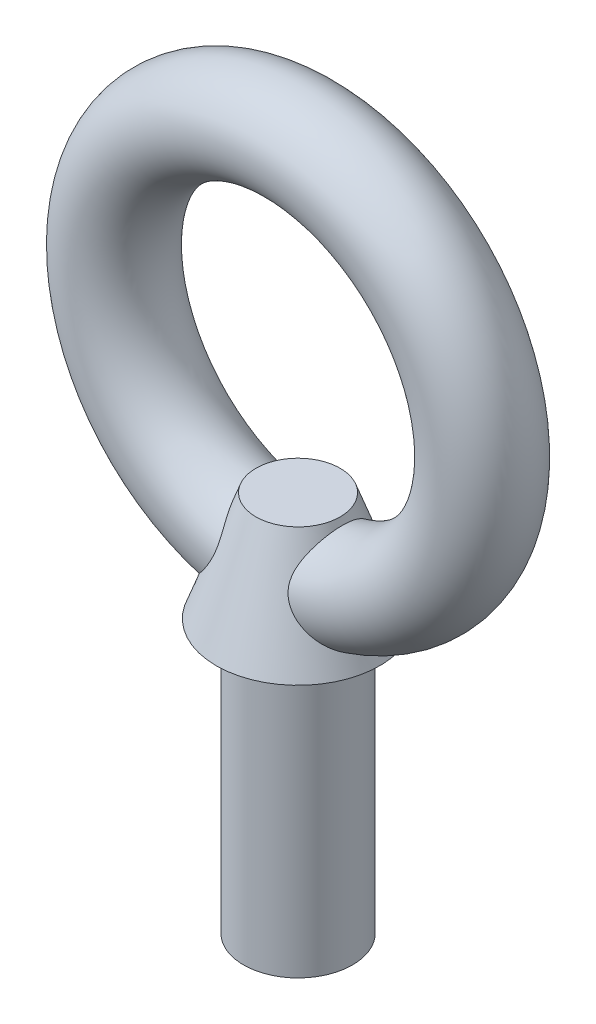
ISO-10303-21;
HEADER;
FILE_DESCRIPTION(('STEP AP214'),'2;1');
FILE_NAME('part.step','',(''),(''),'','','');
FILE_SCHEMA(('AUTOMOTIVE_DESIGN { 1 0 10303 214 1 1 1 1 }'));
ENDSEC;
DATA;
#1=APPLICATION_CONTEXT('core data for automotive mechanical design processes');
#2=APPLICATION_PROTOCOL_DEFINITION('international standard','automotive_design',2000,#1);
#3=PRODUCT_CONTEXT('',#1,'mechanical');
#4=PRODUCT('Part','Part','',(#3));
#5=PRODUCT_RELATED_PRODUCT_CATEGORY('part','',(#4));
#6=PRODUCT_DEFINITION_FORMATION('','',#4);
#7=PRODUCT_DEFINITION_CONTEXT('part definition',#1,'design');
#8=PRODUCT_DEFINITION('design','',#6,#7);
#9=PRODUCT_DEFINITION_SHAPE('','',#8);
#10=(LENGTH_UNIT() NAMED_UNIT(*) SI_UNIT(.MILLI.,.METRE.));
#11=(NAMED_UNIT(*) PLANE_ANGLE_UNIT() SI_UNIT($,.RADIAN.));
#12=(NAMED_UNIT(*) SI_UNIT($,.STERADIAN.) SOLID_ANGLE_UNIT());
#13=UNCERTAINTY_MEASURE_WITH_UNIT(LENGTH_MEASURE(1.E-05),#10,'distance_accuracy_value','');
#14=(GEOMETRIC_REPRESENTATION_CONTEXT(3) GLOBAL_UNCERTAINTY_ASSIGNED_CONTEXT((#13)) GLOBAL_UNIT_ASSIGNED_CONTEXT((#10,
#11,#12)) REPRESENTATION_CONTEXT('',''));
#15=CARTESIAN_POINT('',(0.,0.,0.));
#16=DIRECTION('',(0.,0.,1.));
#17=DIRECTION('',(1.,0.,0.));
#18=AXIS2_PLACEMENT_3D('',#15,#16,#17);
#19=CARTESIAN_POINT('',(0.,-8.5,0.));
#20=DIRECTION('',(0.,-1.,0.));
#21=DIRECTION('',(0.,0.,1.));
#22=AXIS2_PLACEMENT_3D('',#19,#20,#21);
#23=CONICAL_SURFACE('',#22,3.,0.349065850398867);
#24=CARTESIAN_POINT('',(-2.56859902802234,-7.79714728492263,-0.96583477141889));
#25=CARTESIAN_POINT('',(-2.60966585182649,-7.83351581721889,-0.894221925342271));
#26=CARTESIAN_POINT('',(-2.6469279222764,-7.86597148150646,-0.818338519497709));
#27=CARTESIAN_POINT('',(-2.71192304057324,-7.92206599396319,-0.659457913837988));
#28=CARTESIAN_POINT('',(-2.7396485593138,-7.94569787701139,-0.57645515758886));
#29=CARTESIAN_POINT('',(-2.78401330285254,-7.98331791129675,-0.405090654493006));
#30=CARTESIAN_POINT('',(-2.80061498246472,-7.99727340825456,-0.316711846075298));
#31=CARTESIAN_POINT('',(-2.82148845901204,-8.01479748178627,-0.137520355516204));
#32=CARTESIAN_POINT('',(-2.82576610361467,-8.01837098454979,-0.0467088483255237));
#33=CARTESIAN_POINT('',(-2.82182997114935,-8.01507424169583,0.129630225218617));
#34=CARTESIAN_POINT('',(-2.81426365062231,-8.00874532557002,0.215183674735722));
#35=CARTESIAN_POINT('',(-2.7882945188289,-7.98690100722911,0.38340986414287));
#36=CARTESIAN_POINT('',(-2.76989127220263,-7.97138523594349,0.466082488158028));
#37=CARTESIAN_POINT('',(-2.72322555457806,-7.9316886289599,0.626659660873982));
#38=CARTESIAN_POINT('',(-2.69493361620814,-7.90748188906183,0.704549131416647));
#39=CARTESIAN_POINT('',(-2.62995179906049,-7.85118618041316,0.853664971461862));
#40=CARTESIAN_POINT('',(-2.59325974874254,-7.81909517331784,0.924889611298519));
#41=CARTESIAN_POINT('',(-2.50952620847674,-7.74466092028787,1.06556012302248));
#42=CARTESIAN_POINT('',(-2.46185302630946,-7.70165795445651,1.13427883587215));
#43=CARTESIAN_POINT('',(-2.36063762765551,-7.60821959288341,1.26158165507125));
#44=CARTESIAN_POINT('',(-2.30709222406516,-7.55778015588834,1.32016021301529));
#45=CARTESIAN_POINT('',(-2.18883423888335,-7.44300349617977,1.4338118652914));
#46=CARTESIAN_POINT('',(-2.123586808015,-7.37770964985611,1.48736284022285));
#47=CARTESIAN_POINT('',(-1.99138658549109,-7.2391451318824,1.58031366039596));
#48=CARTESIAN_POINT('',(-1.9244325903166,-7.16586870436582,1.61970320530562));
#49=CARTESIAN_POINT('',(-1.79866714784677,-7.01885510014527,1.68066208789264));
#50=CARTESIAN_POINT('',(-1.73968471301715,-6.94581763825648,1.7035649782879));
#51=CARTESIAN_POINT('',(-1.62670855341122,-6.7932202234779,1.73640506974868));
#52=CARTESIAN_POINT('',(-1.57270712109817,-6.7136707199545,1.74636262591922));
#53=CARTESIAN_POINT('',(-1.48814925414256,-6.57110050267061,1.75120876142495));
#54=CARTESIAN_POINT('',(-1.455241836366,-6.50960423938084,1.74950712658479));
#55=CARTESIAN_POINT('',(-1.39697210411965,-6.38389065373007,1.73805558258559));
#56=CARTESIAN_POINT('',(-1.371594263644,-6.3196792470082,1.728322393539));
#57=CARTESIAN_POINT('',(-1.33035806546242,-6.18944131542457,1.70047310528802));
#58=CARTESIAN_POINT('',(-1.3145684105785,-6.12340515520746,1.68229811560735));
#59=CARTESIAN_POINT('',(-1.29356955209459,-5.99229515028454,1.63810824053049));
#60=CARTESIAN_POINT('',(-1.28836557620917,-5.92722179679834,1.61208948878835));
#61=CARTESIAN_POINT('',(-1.28704529716689,-5.78688334259398,1.54730798414894));
#62=CARTESIAN_POINT('',(-1.2930526027153,-5.71232606454648,1.50701876459267));
#63=CARTESIAN_POINT('',(-1.31398760886281,-5.56918702513891,1.41857319916719));
#64=CARTESIAN_POINT('',(-1.32895400659752,-5.50063267338281,1.3703833876615));
#65=CARTESIAN_POINT('',(-1.35868857743523,-5.38862714116315,1.2817807958056));
#66=CARTESIAN_POINT('',(-1.37232406005184,-5.34354595524266,1.24300337838731));
#67=CARTESIAN_POINT('',(-1.40081563868443,-5.25692855495785,1.16203274325406));
#68=CARTESIAN_POINT('',(-1.41567233772168,-5.21539411281997,1.11983783817961));
#69=CARTESIAN_POINT('',(-1.44555899333833,-5.13621203621551,1.03215245894081));
#70=CARTESIAN_POINT('',(-1.46058856224649,-5.09855708816082,0.986668471554838));
#71=CARTESIAN_POINT('',(-1.48999095444549,-5.02745871361626,0.892321882978646));
#72=CARTESIAN_POINT('',(-1.50436384066508,-4.99401488304082,0.843459606656474));
#73=CARTESIAN_POINT('',(-1.53655346516469,-4.92083461104758,0.724301492140808));
#74=CARTESIAN_POINT('',(-1.553769415586,-4.88311004863249,0.652578229815235));
#75=CARTESIAN_POINT('',(-1.58367689636974,-4.81861909440579,0.503451026885274));
#76=CARTESIAN_POINT('',(-1.59637533454582,-4.79183596246148,0.426055979596469));
#77=CARTESIAN_POINT('',(-1.61088104772691,-4.76144950538563,0.306484721596133));
#78=CARTESIAN_POINT('',(-1.61496980938854,-4.75293115002432,0.265794388886273));
#79=CARTESIAN_POINT('',(-1.62143267023246,-4.73949772062444,0.18369795040289));
#80=CARTESIAN_POINT('',(-1.62380768381752,-4.73458072499098,0.142292238428177));
#81=CARTESIAN_POINT('',(-1.62674377118233,-4.72850479553077,0.0591522248654509));
#82=CARTESIAN_POINT('',(-1.62730540802383,-4.72734469517055,0.0174180293086511));
#83=CARTESIAN_POINT('',(-1.62659722704833,-4.7288093325489,-0.0659548191521662));
#84=CARTESIAN_POINT('',(-1.62532758657089,-4.73143370380199,-0.107593480916519));
#85=CARTESIAN_POINT('',(-1.61946182834957,-4.74358464011967,-0.219758626023258));
#86=CARTESIAN_POINT('',(-1.61314565335411,-4.75668524096898,-0.289839383499665));
#87=CARTESIAN_POINT('',(-1.5959935692925,-4.79265998251781,-0.426802639066345));
#88=CARTESIAN_POINT('',(-1.58515484034001,-4.81554022119875,-0.493683112675444));
#89=CARTESIAN_POINT('',(-1.55493854163213,-4.88046987268729,-0.649362574699595));
#90=CARTESIAN_POINT('',(-1.53387998109454,-4.92652793347927,-0.736157266044911));
#91=CARTESIAN_POINT('',(-1.48816507586631,-5.03136402800008,-0.900731169779836));
#92=CARTESIAN_POINT('',(-1.46349855913409,-5.09017825981653,-0.978483738483685));
#93=CARTESIAN_POINT('',(-1.41339772886025,-5.22031001504913,-1.12728069425045));
#94=CARTESIAN_POINT('',(-1.3879650798058,-5.29197749300733,-1.1980171194068));
#95=CARTESIAN_POINT('',(-1.34223285019442,-5.44532033720265,-1.32955227941586));
#96=CARTESIAN_POINT('',(-1.32192352824549,-5.52697626564411,-1.39036979481697));
#97=CARTESIAN_POINT('',(-1.29813778318948,-5.6721986502588,-1.48317651307768));
#98=CARTESIAN_POINT('',(-1.29136241456067,-5.73326153603205,-1.5181834022574));
#99=CARTESIAN_POINT('',(-1.28630072200932,-5.85888627569772,-1.58186175202047));
#100=CARTESIAN_POINT('',(-1.28799311811171,-5.92343895565506,-1.61054890502584));
#101=CARTESIAN_POINT('',(-1.30190206370961,-6.05499372105082,-1.66061630086577));
#102=CARTESIAN_POINT('',(-1.31421475057058,-6.1220128119895,-1.68192729636049));
#103=CARTESIAN_POINT('',(-1.34948787674963,-6.25546580878916,-1.71598946388797));
#104=CARTESIAN_POINT('',(-1.37246052445068,-6.32189895446403,-1.72873078035491));
#105=CARTESIAN_POINT('',(-1.43004480126439,-6.45935812272951,-1.74657532177074));
#106=CARTESIAN_POINT('',(-1.46566040065997,-6.53008300094123,-1.75068156522016));
#107=CARTESIAN_POINT('',(-1.54407698260752,-6.66733339803709,-1.74913062262507));
#108=CARTESIAN_POINT('',(-1.58689333027456,-6.73384950937602,-1.74345231331405));
#109=CARTESIAN_POINT('',(-1.69301903851923,-6.8857221152331,-1.71944977711476));
#110=CARTESIAN_POINT('',(-1.7581415264315,-6.96919760363688,-1.69729630102945));
#111=CARTESIAN_POINT('',(-1.89102859707539,-7.12818773639646,-1.6376838216715));
#112=CARTESIAN_POINT('',(-1.95879617127072,-7.20369298714936,-1.60020700644562));
#113=CARTESIAN_POINT('',(-2.09445142748183,-7.34799490444393,-1.50976332085179));
#114=CARTESIAN_POINT('',(-2.16231668912131,-7.41663592247501,-1.456514307074));
#115=CARTESIAN_POINT('',(-2.29321611236381,-7.54474745793804,-1.33540905897615));
#116=CARTESIAN_POINT('',(-2.35626240264403,-7.60424140698508,-1.26759125176691));
#117=CARTESIAN_POINT('',(-2.44277915333277,-7.68401817988889,-1.1580060365464));
#118=CARTESIAN_POINT('',(-2.46945257856308,-7.70831630704238,-1.12158689413512));
#119=CARTESIAN_POINT('',(-2.52069378002894,-7.75454718648296,-1.045850522251));
#120=CARTESIAN_POINT('',(-2.54526080225667,-7.77647909247746,-1.00653226430095));
#121=CARTESIAN_POINT('',(-2.56859902802234,-7.79714728492263,-0.96583477141889));
#122=B_SPLINE_CURVE_WITH_KNOTS('',3,(#24,#25,#26,#27,#28,#29,#30,#31,#32,#33,#34,#35,#36,#37,
#38,#39,#40,#41,#42,#43,#44,#45,#46,#47,#48,#49,#50,#51,#52,#53,#54,#55,#56,#57,#58,#59,#60,#61,
#62,#63,#64,#65,#66,#67,#68,#69,#70,#71,#72,#73,#74,#75,#76,#77,#78,#79,#80,#81,#82,#83,#84,#85,
#86,#87,#88,#89,#90,#91,#92,#93,#94,#95,#96,#97,#98,#99,#100,#101,#102,#103,#104,#105,#106,#107,
#108,#109,#110,#111,#112,#113,#114,#115,#116,#117,#118,#119,#120,#121),.UNSPECIFIED.,.T.,.F.,(4,
2,2,2,2,2,2,2,2,2,2,2,2,2,2,2,2,2,2,2,2,2,2,2,2,2,2,2,2,2,2,2,2,2,2,2,2,2,2,2,2,2,2,2,2,2,2,2,
4),(0.,0.270458152369922,0.541129343927874,0.812709563965512,1.08416089986846,1.34128332839937,
1.5984160872058,1.8563217036186,2.11429406748641,2.39530932092705,2.67647785522167,
2.99533103492376,3.31441566587528,3.60330675092338,3.89174303511055,4.10029114725928,
4.30840619543748,4.51799538880815,4.72768806224238,4.98115008940807,5.23571487904336,
5.41854176615214,5.601459479523,5.78402579311213,5.96657457484093,6.21425129983313,
6.46154765308767,6.58669876295819,6.71178304660299,6.83682848726955,6.96186181943931,
7.17552813858803,7.38932788173247,7.68912468547188,7.98978361838251,8.30041298429457,
8.61044719683662,8.82190291200144,9.03282749421842,9.24568169572032,9.45878027369073,
9.69537318224761,9.93247749675225,10.2552895859943,10.5784779858299,10.9078382558991,
11.2363402337389,11.3899864995446,11.5436875369143),.UNSPECIFIED.);
#123=CARTESIAN_POINT('',(-2.56859902802234,-7.79714728492263,-0.96583477141889));
#124=VERTEX_POINT('',#123);
#125=EDGE_CURVE('E36',#124,#124,#122,.T.);
#126=ORIENTED_EDGE('',*,*,#125,.F.);
#127=EDGE_LOOP('',(#126));
#128=FACE_BOUND('',#127,.T.);
#129=CARTESIAN_POINT('',(1.41820004627754,-6.42945565649062,-1.7421100464482));
#130=CARTESIAN_POINT('',(1.38958323440857,-6.36596802551526,-1.73561202261204));
#131=CARTESIAN_POINT('',(1.3648349091077,-6.30101703637446,-1.72500754452279));
#132=CARTESIAN_POINT('',(1.32533671092777,-6.16998647191141,-1.69540557351586));
#133=CARTESIAN_POINT('',(1.31058647562861,-6.10390693758674,-1.67640838486624));
#134=CARTESIAN_POINT('',(1.29166498766462,-5.97317197348825,-1.63074477519755));
#135=CARTESIAN_POINT('',(1.28746063066634,-5.90851272048822,-1.60410264646176));
#136=CARTESIAN_POINT('',(1.28798443748223,-5.78230732013143,-1.54432344852829));
#137=CARTESIAN_POINT('',(1.2927300751944,-5.7207675040511,-1.51117378729766));
#138=CARTESIAN_POINT('',(1.31273180239073,-5.5704846975367,-1.42060651263858));
#139=CARTESIAN_POINT('',(1.33220713992373,-5.48448501102023,-1.35960290759566));
#140=CARTESIAN_POINT('',(1.36625490462892,-5.36348573707203,-1.26017337669287));
#141=CARTESIAN_POINT('',(1.37844337876628,-5.32440594748501,-1.2256214223691));
#142=CARTESIAN_POINT('',(1.40367249678529,-5.24901832086453,-1.15390581058104));
#143=CARTESIAN_POINT('',(1.41671274133615,-5.21270920194062,-1.11674337636587));
#144=CARTESIAN_POINT('',(1.44370961806805,-5.14104060017547,-1.03762032119561));
#145=CARTESIAN_POINT('',(1.45767616750252,-5.10585275989277,-0.995506994896762));
#146=CARTESIAN_POINT('',(1.48510635674307,-5.03908059432837,-0.908376963752947));
#147=CARTESIAN_POINT('',(1.49856988525859,-5.00749706334159,-0.863359622347643));
#148=CARTESIAN_POINT('',(1.53714050395389,-4.91906336451954,-0.724245805535743));
#149=CARTESIAN_POINT('',(1.56059083917806,-4.86812514389303,-0.625651213730898));
#150=CARTESIAN_POINT('',(1.591762391736,-4.80153662060836,-0.45416327789672));
#151=CARTESIAN_POINT('',(1.60211932143452,-4.77977505115805,-0.384104774719175));
#152=CARTESIAN_POINT('',(1.61776851702499,-4.74706949296824,-0.240940872896322));
#153=CARTESIAN_POINT('',(1.62306578642833,-4.73611481691052,-0.167838559117701));
#154=CARTESIAN_POINT('',(1.62793883884873,-4.72603297392623,-0.0203385198419764));
#155=CARTESIAN_POINT('',(1.62749313698917,-4.72695022079124,0.054063029582748));
#156=CARTESIAN_POINT('',(1.62088966301201,-4.74062460429334,0.201513771713976));
#157=CARTESIAN_POINT('',(1.61472921230023,-4.75338729307994,0.274562313866651));
#158=CARTESIAN_POINT('',(1.59781399609949,-4.78882328008533,0.414388435385334));
#159=CARTESIAN_POINT('',(1.58725581271288,-4.81107338862331,0.481300198739336));
#160=CARTESIAN_POINT('',(1.56262970336886,-4.86390309852682,0.611024681963907));
#161=CARTESIAN_POINT('',(1.5485596148333,-4.89448783329838,0.673834845952896));
#162=CARTESIAN_POINT('',(1.50896858228716,-4.9828543182825,0.830933895959393));
#163=CARTESIAN_POINT('',(1.48160927913444,-5.04600140924126,0.921767527303286));
#164=CARTESIAN_POINT('',(1.43988565066388,-5.1510059742042,1.0491793462673));
#165=CARTESIAN_POINT('',(1.42583540924933,-5.18780387737653,1.0902487104841));
#166=CARTESIAN_POINT('',(1.3982668693024,-5.26461742214044,1.16945040794511));
#167=CARTESIAN_POINT('',(1.38474840498487,-5.30463204886424,1.20758366014909));
#168=CARTESIAN_POINT('',(1.35135470152398,-5.41276685050929,1.30298258914887));
#169=CARTESIAN_POINT('',(1.33255554389275,-5.48329758675464,1.35793631421204));
#170=CARTESIAN_POINT('',(1.30323549697133,-5.63164962607105,1.45931281739962));
#171=CARTESIAN_POINT('',(1.29268122562171,-5.70944008731638,1.50576940708388));
#172=CARTESIAN_POINT('',(1.28646398574288,-5.84893090603456,1.57704061936849));
#173=CARTESIAN_POINT('',(1.28751493109595,-5.90920487507458,1.60429810092179));
#174=CARTESIAN_POINT('',(1.2986648231791,-6.03148287271489,1.65228036502122));
#175=CARTESIAN_POINT('',(1.30875251260687,-6.0934846558528,1.673013232036));
#176=CARTESIAN_POINT('',(1.33821166590929,-6.21735381812317,1.70720493219756));
#177=CARTESIAN_POINT('',(1.35759319233307,-6.27922097839282,1.72065584740183));
#178=CARTESIAN_POINT('',(1.40430258209515,-6.4011365154502,1.74014694452352));
#179=CARTESIAN_POINT('',(1.43164461176042,-6.46118143722541,1.74617381388404));
#180=CARTESIAN_POINT('',(1.50243637888378,-6.5982314586081,1.75200139298277));
#181=CARTESIAN_POINT('',(1.54820999726145,-6.67414092820313,1.74902293856133));
#182=CARTESIAN_POINT('',(1.64593730021937,-6.82047203178931,1.73163137805005));
#183=CARTESIAN_POINT('',(1.6979041982487,-6.89088138197791,1.71719343794377));
#184=CARTESIAN_POINT('',(1.82036277698665,-7.04602509020038,1.67197503175956));
#185=CARTESIAN_POINT('',(1.89183974899462,-7.12895475700325,1.63765825858493));
#186=CARTESIAN_POINT('',(2.03468176439283,-7.28581423392079,1.55239576881217));
#187=CARTESIAN_POINT('',(2.10604677362458,-7.35974168481648,1.50144570593486));
#188=CARTESIAN_POINT('',(2.24508466747882,-7.49847845728849,1.38313659666122));
#189=CARTESIAN_POINT('',(2.31273410914624,-7.56323322856969,1.31568539631086));
#190=CARTESIAN_POINT('',(2.43994020133314,-7.68186485977314,1.16529844836029));
#191=CARTESIAN_POINT('',(2.49950126469889,-7.73574765906991,1.08237120327288));
#192=CARTESIAN_POINT('',(2.60377641009663,-7.82844544949764,0.907250777639681));
#193=CARTESIAN_POINT('',(2.64910208523145,-7.86789892736916,0.815764909177284));
#194=CARTESIAN_POINT('',(2.72557589587965,-7.93378610346724,0.622724788101609));
#195=CARTESIAN_POINT('',(2.75674088303641,-7.96023528029623,0.521182678994754));
#196=CARTESIAN_POINT('',(2.79903840506156,-7.99597006985649,0.326727411236814));
#197=CARTESIAN_POINT('',(2.81239072451125,-8.00716268398317,0.234642936218893));
#198=CARTESIAN_POINT('',(2.82583072514296,-8.01842864574742,0.0488541269732811));
#199=CARTESIAN_POINT('',(2.82592618004948,-8.01850850981711,-0.0448492257132111));
#200=CARTESIAN_POINT('',(2.81342492121793,-8.00802967457296,-0.222699257727255));
#201=CARTESIAN_POINT('',(2.80190905213282,-7.9983769392546,-0.306979885884551));
#202=CARTESIAN_POINT('',(2.76848388182402,-7.97016944050756,-0.471891450883293));
#203=CARTESIAN_POINT('',(2.74657456017285,-7.95161465958263,-0.552522380551213));
#204=CARTESIAN_POINT('',(2.69303713741366,-7.9058159849327,-0.7097109497097));
#205=CARTESIAN_POINT('',(2.66122961324341,-7.87841129235813,-0.786159931072941));
#206=CARTESIAN_POINT('',(2.58963492226697,-7.815860333906,-0.931782297144969));
#207=CARTESIAN_POINT('',(2.5498452759358,-7.78071166214473,-1.00095341089099));
#208=CARTESIAN_POINT('',(2.45965137694313,-7.6995890557861,-1.13760848681319));
#209=CARTESIAN_POINT('',(2.40858052811077,-7.65287972060693,-1.20421390160552));
#210=CARTESIAN_POINT('',(2.30112875423779,-7.55201912448539,-1.32662816188055));
#211=CARTESIAN_POINT('',(2.24474470376451,-7.49786347462212,-1.3824305929361));
#212=CARTESIAN_POINT('',(2.12110759165278,-7.37503065894707,-1.48956925077767));
#213=CARTESIAN_POINT('',(2.05341513663386,-7.30538008296642,-1.53928408933796));
#214=CARTESIAN_POINT('',(1.91746686255562,-7.15782186233511,-1.62375025858664));
#215=CARTESIAN_POINT('',(1.84921055208229,-7.07990611090292,-1.65848672566));
#216=CARTESIAN_POINT('',(1.72786754710429,-6.93010125903445,-1.70748191411379));
#217=CARTESIAN_POINT('',(1.67419812380549,-6.85949844266804,-1.72424242551855));
#218=CARTESIAN_POINT('',(1.57270536106527,-6.71271373078545,-1.74603170203717));
#219=CARTESIAN_POINT('',(1.52485668535773,-6.63655850495671,-1.75111317048413));
#220=CARTESIAN_POINT('',(1.47066119474298,-6.53681422726416,-1.74944324482562));
#221=CARTESIAN_POINT('',(1.45959620517711,-6.51559941137625,-1.74863422186758));
#222=CARTESIAN_POINT('',(1.43826878427201,-6.47279915819299,-1.74608159254457));
#223=CARTESIAN_POINT('',(1.42800724147635,-6.45121334188676,-1.74433696775794));
#224=CARTESIAN_POINT('',(1.41820004627754,-6.42945565649062,-1.7421100464482));
#225=B_SPLINE_CURVE_WITH_KNOTS('',3,(#129,#130,#131,#132,#133,#134,#135,#136,#137,#138,#139,
#140,#141,#142,#143,#144,#145,#146,#147,#148,#149,#150,#151,#152,#153,#154,#155,#156,#157,#158,
#159,#160,#161,#162,#163,#164,#165,#166,#167,#168,#169,#170,#171,#172,#173,#174,#175,#176,#177,
#178,#179,#180,#181,#182,#183,#184,#185,#186,#187,#188,#189,#190,#191,#192,#193,#194,#195,#196,
#197,#198,#199,#200,#201,#202,#203,#204,#205,#206,#207,#208,#209,#210,#211,#212,#213,#214,#215,
#216,#217,#218,#219,#220,#221,#222,#223,#224),.UNSPECIFIED.,.T.,.F.,(4,2,2,2,2,2,2,2,2,2,2,2,2,
2,2,2,2,2,2,2,2,2,2,2,2,2,2,2,2,2,2,2,2,2,2,2,2,2,2,2,2,2,2,2,2,2,2,4),(0.,0.20971926568824,
0.419430928869826,0.628483462284721,0.83794457077466,1.1577248232145,1.31835072244451,
1.47890184945336,1.64859002573413,1.81831552490495,2.15593665153956,2.37734578307158,
2.59853573514345,2.82055341453972,3.04267520978162,3.25578329514873,3.46902293441432,
3.80888701131901,3.97949004634394,4.1500394662285,4.42332346783464,4.69549517283138,
4.89314436656686,5.09054768553024,5.28816521969006,5.48613660173716,5.75075664725472,
6.01595172562452,6.35842724885313,6.70099233267046,7.04551605699634,7.38985105484131,
7.71625661712182,8.04227272308594,8.32188985939429,8.60134302964894,8.85698315671479,
9.11262378622259,9.37319861471855,9.63385451251539,9.92087874685808,10.2080728867556,
10.5340595702978,10.8603690026619,11.1302744100733,11.3989594193597,11.4707534699553,
11.5426258289369),.UNSPECIFIED.);
#226=CARTESIAN_POINT('',(1.41820004627754,-6.42945565649062,-1.7421100464482));
#227=VERTEX_POINT('',#226);
#228=EDGE_CURVE('E47',#227,#227,#225,.T.);
#229=ORIENTED_EDGE('',*,*,#228,.F.);
#230=EDGE_LOOP('',(#229));
#231=FACE_BOUND('',#230,.T.);
#232=CARTESIAN_POINT('',(0.,-4.5,0.));
#233=DIRECTION('',(0.,1.,0.));
#234=DIRECTION('',(0.,0.,1.));
#235=AXIS2_PLACEMENT_3D('',#232,#233,#234);
#236=CIRCLE('',#235,1.54411906293519);
#237=CARTESIAN_POINT('',(0.,-4.5,1.54411906293519));
#238=VERTEX_POINT('',#237);
#239=EDGE_CURVE('E54',#238,#238,#236,.T.);
#240=ORIENTED_EDGE('',*,*,#239,.F.);
#241=EDGE_LOOP('',(#240));
#242=FACE_BOUND('',#241,.T.);
#243=CARTESIAN_POINT('',(0.,-8.5,0.));
#244=DIRECTION('',(0.,1.,0.));
#245=DIRECTION('',(0.,0.,1.));
#246=AXIS2_PLACEMENT_3D('',#243,#244,#245);
#247=CIRCLE('',#246,3.);
#248=CARTESIAN_POINT('',(0.,-8.5,3.));
#249=VERTEX_POINT('',#248);
#250=EDGE_CURVE('E51',#249,#249,#247,.T.);
#251=ORIENTED_EDGE('',*,*,#250,.T.);
#252=EDGE_LOOP('',(#251));
#253=FACE_BOUND('',#252,.T.);
#254=ADVANCED_FACE('F31',(#128,#231,#242,#253),#23,.T.);
#255=CARTESIAN_POINT('',(0.,-4.5,0.));
#256=DIRECTION('',(0.,1.,0.));
#257=DIRECTION('',(0.,0.,1.));
#258=AXIS2_PLACEMENT_3D('',#255,#256,#257);
#259=PLANE('',#258);
#260=ORIENTED_EDGE('',*,*,#239,.T.);
#261=EDGE_LOOP('',(#260));
#262=FACE_BOUND('',#261,.T.);
#263=ADVANCED_FACE('F63',(#262),#259,.T.);
#264=CARTESIAN_POINT('',(0.,-8.5,0.));
#265=DIRECTION('',(0.,1.,0.));
#266=DIRECTION('',(0.,0.,1.));
#267=AXIS2_PLACEMENT_3D('',#264,#265,#266);
#268=PLANE('',#267);
#269=CARTESIAN_POINT('',(0.,-8.5,0.));
#270=DIRECTION('',(0.,-1.,0.));
#271=DIRECTION('',(0.,0.,-1.));
#272=AXIS2_PLACEMENT_3D('',#269,#270,#271);
#273=CIRCLE('',#272,2.);
#274=CARTESIAN_POINT('',(0.,-8.5,-2.));
#275=VERTEX_POINT('',#274);
#276=EDGE_CURVE('E10',#275,#275,#273,.T.);
#277=ORIENTED_EDGE('',*,*,#276,.F.);
#278=EDGE_LOOP('',(#277));
#279=FACE_BOUND('',#278,.T.);
#280=ORIENTED_EDGE('',*,*,#250,.F.);
#281=EDGE_LOOP('',(#280));
#282=FACE_BOUND('',#281,.T.);
#283=ADVANCED_FACE('F65',(#279,#282),#268,.F.);
#284=CARTESIAN_POINT('',(0.,0.,0.));
#285=DIRECTION('',(0.,0.,1.));
#286=DIRECTION('',(1.,0.,0.));
#287=AXIS2_PLACEMENT_3D('',#284,#285,#286);
#288=TOROIDAL_SURFACE('',#287,6.75,1.75);
#289=ORIENTED_EDGE('',*,*,#228,.T.);
#290=EDGE_LOOP('',(#289));
#291=FACE_BOUND('',#290,.T.);
#292=ORIENTED_EDGE('',*,*,#125,.T.);
#293=EDGE_LOOP('',(#292));
#294=FACE_BOUND('',#293,.T.);
#295=ADVANCED_FACE('F33',(#291,#294),#288,.T.);
#296=CARTESIAN_POINT('',(0.,-18.5,0.));
#297=DIRECTION('',(0.,1.,0.));
#298=DIRECTION('',(0.,0.,1.));
#299=AXIS2_PLACEMENT_3D('',#296,#297,#298);
#300=CYLINDRICAL_SURFACE('',#299,2.);
#301=CARTESIAN_POINT('',(0.,-18.5,0.));
#302=DIRECTION('',(0.,-1.,0.));
#303=DIRECTION('',(0.,0.,-1.));
#304=AXIS2_PLACEMENT_3D('',#301,#302,#303);
#305=CIRCLE('',#304,2.);
#306=CARTESIAN_POINT('',(0.,-18.5,-2.));
#307=VERTEX_POINT('',#306);
#308=EDGE_CURVE('E50',#307,#307,#305,.T.);
#309=ORIENTED_EDGE('',*,*,#308,.F.);
#310=EDGE_LOOP('',(#309));
#311=FACE_BOUND('',#310,.T.);
#312=ORIENTED_EDGE('',*,*,#276,.T.);
#313=EDGE_LOOP('',(#312));
#314=FACE_BOUND('',#313,.T.);
#315=ADVANCED_FACE('F73',(#311,#314),#300,.T.);
#316=CARTESIAN_POINT('',(0.,-18.5,0.));
#317=DIRECTION('',(0.,-1.,0.));
#318=DIRECTION('',(0.,0.,-1.));
#319=AXIS2_PLACEMENT_3D('',#316,#317,#318);
#320=PLANE('',#319);
#321=ORIENTED_EDGE('',*,*,#308,.T.);
#322=EDGE_LOOP('',(#321));
#323=FACE_BOUND('',#322,.T.);
#324=ADVANCED_FACE('F76',(#323),#320,.T.);
#325=CLOSED_SHELL('',(#254,#263,#283,#295,#315,#324));
#326=MANIFOLD_SOLID_BREP('B2',#325);
#327=ADVANCED_BREP_SHAPE_REPRESENTATION('',(#18,#326),#14);
#328=SHAPE_DEFINITION_REPRESENTATION(#9,#327);
ENDSEC;
END-ISO-10303-21;
